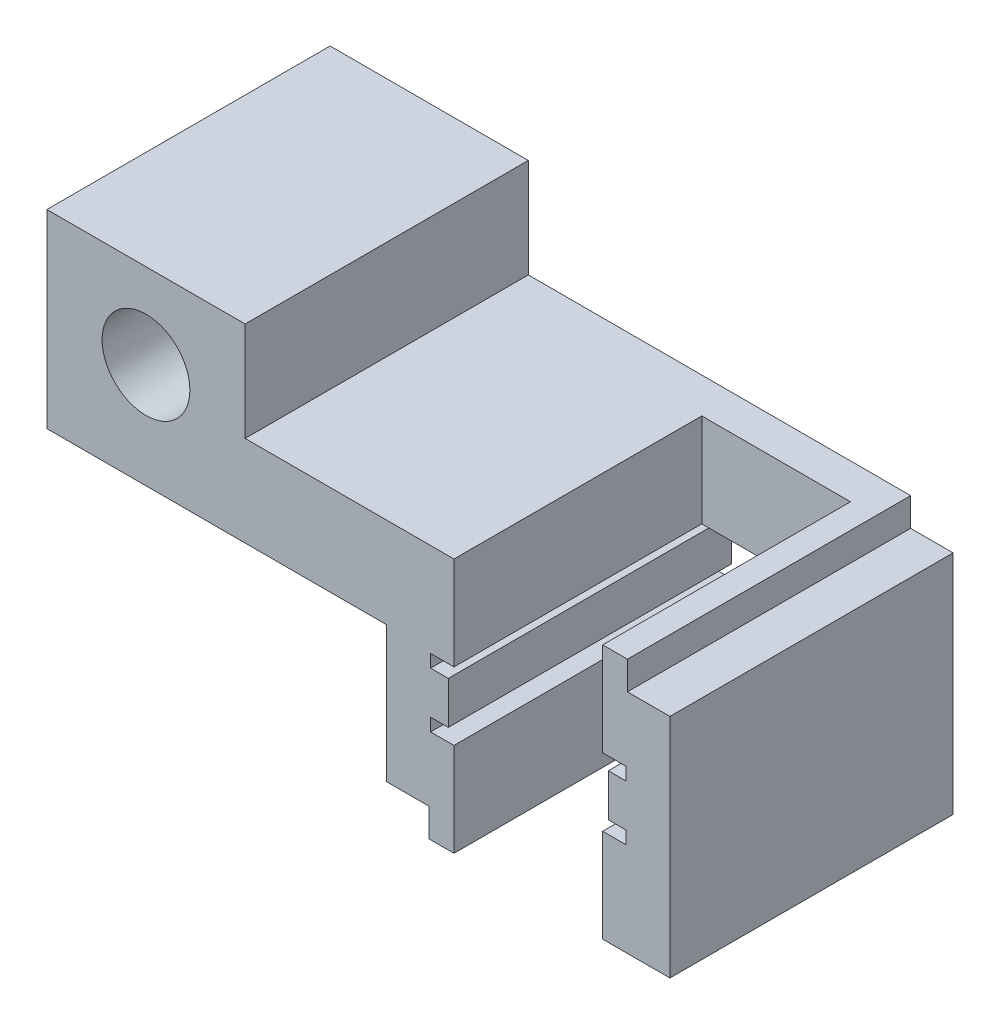
ISO-10303-21;
HEADER;
FILE_DESCRIPTION(('STEP AP214'),'2;1');
FILE_NAME('part.step','',(''),(''),'','','');
FILE_SCHEMA(('AUTOMOTIVE_DESIGN { 1 0 10303 214 1 1 1 1 }'));
ENDSEC;
DATA;
#1=APPLICATION_CONTEXT('core data for automotive mechanical design processes');
#2=APPLICATION_PROTOCOL_DEFINITION('international standard','automotive_design',2000,#1);
#3=PRODUCT_CONTEXT('',#1,'mechanical');
#4=PRODUCT('Part','Part','',(#3));
#5=PRODUCT_RELATED_PRODUCT_CATEGORY('part','',(#4));
#6=PRODUCT_DEFINITION_FORMATION('','',#4);
#7=PRODUCT_DEFINITION_CONTEXT('part definition',#1,'design');
#8=PRODUCT_DEFINITION('design','',#6,#7);
#9=PRODUCT_DEFINITION_SHAPE('','',#8);
#10=(LENGTH_UNIT() NAMED_UNIT(*) SI_UNIT(.MILLI.,.METRE.));
#11=(NAMED_UNIT(*) PLANE_ANGLE_UNIT() SI_UNIT($,.RADIAN.));
#12=(NAMED_UNIT(*) SI_UNIT($,.STERADIAN.) SOLID_ANGLE_UNIT());
#13=UNCERTAINTY_MEASURE_WITH_UNIT(LENGTH_MEASURE(1.E-05),#10,'distance_accuracy_value','');
#14=(GEOMETRIC_REPRESENTATION_CONTEXT(3) GLOBAL_UNCERTAINTY_ASSIGNED_CONTEXT((#13)) GLOBAL_UNIT_ASSIGNED_CONTEXT((#10,
#11,#12)) REPRESENTATION_CONTEXT('',''));
#15=CARTESIAN_POINT('',(0.,0.,0.));
#16=DIRECTION('',(0.,0.,1.));
#17=DIRECTION('',(1.,0.,0.));
#18=AXIS2_PLACEMENT_3D('',#15,#16,#17);
#19=CARTESIAN_POINT('',(0.,0.,0.));
#20=DIRECTION('',(0.,0.,1.));
#21=DIRECTION('',(1.,0.,0.));
#22=AXIS2_PLACEMENT_3D('',#19,#20,#21);
#23=PLANE('',#22);
#24=DIRECTION('',(-1.,0.,0.));
#25=VECTOR('',#24,1.);
#26=CARTESIAN_POINT('',(-9.54356846473029,10.3630705394191,0.));
#27=LINE('',#26,#25);
#28=CARTESIAN_POINT('',(-4.79356846473029,10.3630705394191,0.));
#29=VERTEX_POINT('',#28);
#30=CARTESIAN_POINT('',(-19.5435684647303,10.3630705394191,0.));
#31=VERTEX_POINT('',#30);
#32=EDGE_CURVE('E472',#29,#31,#27,.T.);
#33=ORIENTED_EDGE('',*,*,#32,.T.);
#34=DIRECTION('',(0.,-1.,0.));
#35=VECTOR('',#34,1.);
#36=CARTESIAN_POINT('',(-19.5435684647303,17.3630705394191,0.));
#37=LINE('',#36,#35);
#38=CARTESIAN_POINT('',(-19.5435684647303,17.3630705394191,0.));
#39=VERTEX_POINT('',#38);
#40=EDGE_CURVE('E257',#39,#31,#37,.T.);
#41=ORIENTED_EDGE('',*,*,#40,.F.);
#42=DIRECTION('',(1.,0.,0.));
#43=VECTOR('',#42,1.);
#44=CARTESIAN_POINT('',(-33.5435684647303,17.3630705394191,0.));
#45=LINE('',#44,#43);
#46=CARTESIAN_POINT('',(-33.5435684647303,17.3630705394191,0.));
#47=VERTEX_POINT('',#46);
#48=EDGE_CURVE('E267',#47,#39,#45,.T.);
#49=ORIENTED_EDGE('',*,*,#48,.F.);
#50=DIRECTION('',(0.,1.,0.));
#51=VECTOR('',#50,1.);
#52=CARTESIAN_POINT('',(-33.5435684647303,17.3630705394191,0.));
#53=LINE('',#52,#51);
#54=CARTESIAN_POINT('',(-33.5435684647303,3.96307053941909,0.));
#55=VERTEX_POINT('',#54);
#56=EDGE_CURVE('E277',#55,#47,#53,.T.);
#57=ORIENTED_EDGE('',*,*,#56,.F.);
#58=DIRECTION('',(1.,0.,0.));
#59=VECTOR('',#58,1.);
#60=CARTESIAN_POINT('',(-33.5435684647303,3.96307053941909,0.));
#61=LINE('',#60,#59);
#62=CARTESIAN_POINT('',(-9.54356846473029,3.96307053941909,0.));
#63=VERTEX_POINT('',#62);
#64=EDGE_CURVE('E275',#55,#63,#61,.T.);
#65=ORIENTED_EDGE('',*,*,#64,.T.);
#66=DIRECTION('',(0.,-1.,0.));
#67=VECTOR('',#66,1.);
#68=CARTESIAN_POINT('',(-9.54356846473029,2.86307053941909,0.));
#69=LINE('',#68,#67);
#70=CARTESIAN_POINT('',(-9.54356846473028,-5.63692946058091,0.));
#71=VERTEX_POINT('',#70);
#72=EDGE_CURVE('E482',#63,#71,#69,.T.);
#73=ORIENTED_EDGE('',*,*,#72,.T.);
#74=DIRECTION('',(-1.,0.,0.));
#75=VECTOR('',#74,1.);
#76=CARTESIAN_POINT('',(-9.54356846473028,-5.63692946058091,0.));
#77=LINE('',#76,#75);
#78=CARTESIAN_POINT('',(-6.54356846473028,-5.63692946058091,0.));
#79=VERTEX_POINT('',#78);
#80=EDGE_CURVE('E284',#79,#71,#77,.T.);
#81=ORIENTED_EDGE('',*,*,#80,.F.);
#82=DIRECTION('',(0.,1.,0.));
#83=VECTOR('',#82,1.);
#84=CARTESIAN_POINT('',(-6.54356846473028,-7.63692946058091,0.));
#85=LINE('',#84,#83);
#86=CARTESIAN_POINT('',(-6.54356846473028,-7.63692946058091,0.));
#87=VERTEX_POINT('',#86);
#88=EDGE_CURVE('E288',#87,#79,#85,.T.);
#89=ORIENTED_EDGE('',*,*,#88,.F.);
#90=DIRECTION('',(1.,0.,0.));
#91=VECTOR('',#90,1.);
#92=CARTESIAN_POINT('',(-9.54356846473028,-7.63692946058091,0.));
#93=LINE('',#92,#91);
#94=CARTESIAN_POINT('',(-4.79356846473028,-7.63692946058091,0.));
#95=VERTEX_POINT('',#94);
#96=EDGE_CURVE('E468',#87,#95,#93,.T.);
#97=ORIENTED_EDGE('',*,*,#96,.T.);
#98=DIRECTION('',(0.,-1.,0.));
#99=VECTOR('',#98,1.);
#100=CARTESIAN_POINT('',(-4.79356846473028,-1.03692946058091,0.));
#101=LINE('',#100,#99);
#102=CARTESIAN_POINT('',(-4.79356846473028,-1.03692946058091,0.));
#103=VERTEX_POINT('',#102);
#104=EDGE_CURVE('E315',#103,#95,#101,.T.);
#105=ORIENTED_EDGE('',*,*,#104,.F.);
#106=DIRECTION('',(1.,0.,0.));
#107=VECTOR('',#106,1.);
#108=CARTESIAN_POINT('',(-6.44356846473029,-1.03692946058091,0.));
#109=LINE('',#108,#107);
#110=CARTESIAN_POINT('',(-6.44356846473029,-1.03692946058091,0.));
#111=VERTEX_POINT('',#110);
#112=EDGE_CURVE('E425',#111,#103,#109,.T.);
#113=ORIENTED_EDGE('',*,*,#112,.F.);
#114=DIRECTION('',(0.,-1.,0.));
#115=VECTOR('',#114,1.);
#116=CARTESIAN_POINT('',(-6.44356846473029,-0.136929460580913,0.));
#117=LINE('',#116,#115);
#118=CARTESIAN_POINT('',(-6.44356846473029,-0.136929460580913,0.));
#119=VERTEX_POINT('',#118);
#120=EDGE_CURVE('E400',#119,#111,#117,.T.);
#121=ORIENTED_EDGE('',*,*,#120,.F.);
#122=DIRECTION('',(-1.,0.,0.));
#123=VECTOR('',#122,1.);
#124=CARTESIAN_POINT('',(-6.44356846473029,-0.136929460580913,0.));
#125=LINE('',#124,#123);
#126=CARTESIAN_POINT('',(-5.19356846473029,-0.136929460580913,0.));
#127=VERTEX_POINT('',#126);
#128=EDGE_CURVE('E431',#127,#119,#125,.T.);
#129=ORIENTED_EDGE('',*,*,#128,.F.);
#130=DIRECTION('',(0.,-1.,0.));
#131=VECTOR('',#130,1.);
#132=CARTESIAN_POINT('',(-5.19356846473029,2.86307053941909,0.));
#133=LINE('',#132,#131);
#134=CARTESIAN_POINT('',(-5.19356846473029,2.86307053941909,0.));
#135=VERTEX_POINT('',#134);
#136=EDGE_CURVE('E436',#135,#127,#133,.T.);
#137=ORIENTED_EDGE('',*,*,#136,.F.);
#138=DIRECTION('',(1.,0.,0.));
#139=VECTOR('',#138,1.);
#140=CARTESIAN_POINT('',(-6.44356846473029,2.86307053941909,0.));
#141=LINE('',#140,#139);
#142=CARTESIAN_POINT('',(-6.44356846473029,2.86307053941909,0.));
#143=VERTEX_POINT('',#142);
#144=EDGE_CURVE('E389',#143,#135,#141,.T.);
#145=ORIENTED_EDGE('',*,*,#144,.F.);
#146=DIRECTION('',(0.,-1.,0.));
#147=VECTOR('',#146,1.);
#148=CARTESIAN_POINT('',(-6.44356846473029,3.76307053941909,0.));
#149=LINE('',#148,#147);
#150=CARTESIAN_POINT('',(-6.44356846473029,3.76307053941909,0.));
#151=VERTEX_POINT('',#150);
#152=EDGE_CURVE('E363',#151,#143,#149,.T.);
#153=ORIENTED_EDGE('',*,*,#152,.F.);
#154=DIRECTION('',(-1.,0.,0.));
#155=VECTOR('',#154,1.);
#156=CARTESIAN_POINT('',(-6.44356846473029,3.76307053941909,0.));
#157=LINE('',#156,#155);
#158=CARTESIAN_POINT('',(-4.79356846473029,3.76307053941909,0.));
#159=VERTEX_POINT('',#158);
#160=EDGE_CURVE('E394',#159,#151,#157,.T.);
#161=ORIENTED_EDGE('',*,*,#160,.F.);
#162=DIRECTION('',(0.,-1.,0.));
#163=VECTOR('',#162,1.);
#164=CARTESIAN_POINT('',(-4.79356846473029,10.3630705394191,0.));
#165=LINE('',#164,#163);
#166=EDGE_CURVE('E337',#29,#159,#165,.T.);
#167=ORIENTED_EDGE('',*,*,#166,.F.);
#168=EDGE_LOOP('',(#33,#41,#49,#57,#65,#73,#81,#89,#97,#105,#113,#121,#129,#137,#145,#153,#161,#167));
#169=FACE_BOUND('',#168,.T.);
#170=CARTESIAN_POINT('',(-26.5435684647303,11.3630705394191,0.));
#171=DIRECTION('',(0.,0.,1.));
#172=DIRECTION('',(1.,0.,0.));
#173=AXIS2_PLACEMENT_3D('',#170,#171,#172);
#174=CIRCLE('',#173,3.1);
#175=CARTESIAN_POINT('',(-23.4435684647303,11.3630705394191,0.));
#176=VERTEX_POINT('',#175);
#177=EDGE_CURVE('E613',#176,#176,#174,.T.);
#178=ORIENTED_EDGE('',*,*,#177,.F.);
#179=EDGE_LOOP('',(#178));
#180=FACE_BOUND('',#179,.T.);
#181=ADVANCED_FACE('F35',(#169,#180),#23,.T.);
#182=CARTESIAN_POINT('',(-9.54356846473029,2.86307053941909,-20.));
#183=DIRECTION('',(-1.,0.,0.));
#184=DIRECTION('',(0.,0.,1.));
#185=AXIS2_PLACEMENT_3D('',#182,#183,#184);
#186=PLANE('',#185);
#187=DIRECTION('',(0.,0.,1.));
#188=VECTOR('',#187,1.);
#189=CARTESIAN_POINT('',(-9.54356846473029,3.96307053941909,-20.));
#190=LINE('',#189,#188);
#191=CARTESIAN_POINT('',(-9.54356846473029,3.96307053941909,-20.));
#192=VERTEX_POINT('',#191);
#193=EDGE_CURVE('E52',#192,#63,#190,.T.);
#194=ORIENTED_EDGE('',*,*,#193,.F.);
#195=DIRECTION('',(0.,-1.,0.));
#196=VECTOR('',#195,1.);
#197=CARTESIAN_POINT('',(-9.54356846473029,2.86307053941909,-20.));
#198=LINE('',#197,#196);
#199=CARTESIAN_POINT('',(-9.54356846473028,-5.63692946058091,-20.));
#200=VERTEX_POINT('',#199);
#201=EDGE_CURVE('E44',#192,#200,#198,.T.);
#202=ORIENTED_EDGE('',*,*,#201,.T.);
#203=DIRECTION('',(0.,0.,1.));
#204=VECTOR('',#203,1.);
#205=CARTESIAN_POINT('',(-9.54356846473028,-5.63692946058091,-20.));
#206=LINE('',#205,#204);
#207=EDGE_CURVE('E294',#200,#71,#206,.T.);
#208=ORIENTED_EDGE('',*,*,#207,.T.);
#209=ORIENTED_EDGE('',*,*,#72,.F.);
#210=EDGE_LOOP('',(#194,#202,#208,#209));
#211=FACE_BOUND('',#210,.T.);
#212=ADVANCED_FACE('F37',(#211),#186,.T.);
#213=CARTESIAN_POINT('',(10.4564315352697,2.86307053941909,-20.));
#214=DIRECTION('',(1.,0.,0.));
#215=DIRECTION('',(0.,0.,-1.));
#216=AXIS2_PLACEMENT_3D('',#213,#214,#215);
#217=PLANE('',#216);
#218=DIRECTION('',(0.,0.,1.));
#219=VECTOR('',#218,1.);
#220=CARTESIAN_POINT('',(10.4564315352697,8.36307053941909,-20.));
#221=LINE('',#220,#219);
#222=CARTESIAN_POINT('',(10.4564315352697,8.36307053941909,-20.));
#223=VERTEX_POINT('',#222);
#224=CARTESIAN_POINT('',(10.4564315352697,8.36307053941909,0.));
#225=VERTEX_POINT('',#224);
#226=EDGE_CURVE('E312',#223,#225,#221,.T.);
#227=ORIENTED_EDGE('',*,*,#226,.T.);
#228=DIRECTION('',(0.,1.,0.));
#229=VECTOR('',#228,1.);
#230=CARTESIAN_POINT('',(10.4564315352697,2.86307053941909,0.));
#231=LINE('',#230,#229);
#232=CARTESIAN_POINT('',(10.4564315352697,-7.63692946058091,0.));
#233=VERTEX_POINT('',#232);
#234=EDGE_CURVE('E494',#233,#225,#231,.T.);
#235=ORIENTED_EDGE('',*,*,#234,.F.);
#236=DIRECTION('',(0.,0.,1.));
#237=VECTOR('',#236,1.);
#238=CARTESIAN_POINT('',(10.4564315352697,-7.63692946058091,-20.));
#239=LINE('',#238,#237);
#240=CARTESIAN_POINT('',(10.4564315352697,-7.63692946058091,-20.));
#241=VERTEX_POINT('',#240);
#242=EDGE_CURVE('E467',#241,#233,#239,.T.);
#243=ORIENTED_EDGE('',*,*,#242,.F.);
#244=DIRECTION('',(0.,1.,0.));
#245=VECTOR('',#244,1.);
#246=CARTESIAN_POINT('',(10.4564315352697,2.86307053941909,-20.));
#247=LINE('',#246,#245);
#248=EDGE_CURVE('E11',#241,#223,#247,.T.);
#249=ORIENTED_EDGE('',*,*,#248,.T.);
#250=EDGE_LOOP('',(#227,#235,#243,#249));
#251=FACE_BOUND('',#250,.T.);
#252=ADVANCED_FACE('F508',(#251),#217,.T.);
#253=CARTESIAN_POINT('',(0.,0.,-20.));
#254=DIRECTION('',(0.,0.,1.));
#255=DIRECTION('',(1.,0.,0.));
#256=AXIS2_PLACEMENT_3D('',#253,#254,#255);
#257=PLANE('',#256);
#258=CARTESIAN_POINT('',(-26.5435684647303,11.3630705394191,-20.));
#259=DIRECTION('',(0.,0.,1.));
#260=DIRECTION('',(1.,0.,0.));
#261=AXIS2_PLACEMENT_3D('',#258,#259,#260);
#262=CIRCLE('',#261,1.45);
#263=CARTESIAN_POINT('',(-25.0935684647303,11.3630705394191,-20.));
#264=VERTEX_POINT('',#263);
#265=EDGE_CURVE('E607',#264,#264,#262,.T.);
#266=ORIENTED_EDGE('',*,*,#265,.T.);
#267=EDGE_LOOP('',(#266));
#268=FACE_BOUND('',#267,.T.);
#269=DIRECTION('',(0.,-1.,0.));
#270=VECTOR('',#269,1.);
#271=CARTESIAN_POINT('',(-6.44356846473029,3.76307053941909,-20.));
#272=LINE('',#271,#270);
#273=CARTESIAN_POINT('',(-6.44356846473029,3.76307053941909,-20.));
#274=VERTEX_POINT('',#273);
#275=CARTESIAN_POINT('',(-6.44356846473029,2.86307053941909,-20.));
#276=VERTEX_POINT('',#275);
#277=EDGE_CURVE('E371',#274,#276,#272,.T.);
#278=ORIENTED_EDGE('',*,*,#277,.T.);
#279=DIRECTION('',(1.,0.,0.));
#280=VECTOR('',#279,1.);
#281=CARTESIAN_POINT('',(-6.44356846473029,2.86307053941909,-20.));
#282=LINE('',#281,#280);
#283=CARTESIAN_POINT('',(-5.19356846473029,2.86307053941909,-20.));
#284=VERTEX_POINT('',#283);
#285=EDGE_CURVE('E376',#276,#284,#282,.T.);
#286=ORIENTED_EDGE('',*,*,#285,.T.);
#287=DIRECTION('',(0.,-1.,0.));
#288=VECTOR('',#287,1.);
#289=CARTESIAN_POINT('',(-5.19356846473029,2.86307053941909,-20.));
#290=LINE('',#289,#288);
#291=CARTESIAN_POINT('',(-5.19356846473029,-0.136929460580913,-20.));
#292=VERTEX_POINT('',#291);
#293=EDGE_CURVE('E443',#284,#292,#290,.T.);
#294=ORIENTED_EDGE('',*,*,#293,.T.);
#295=DIRECTION('',(-1.,0.,0.));
#296=VECTOR('',#295,1.);
#297=CARTESIAN_POINT('',(-6.44356846473029,-0.136929460580913,-20.));
#298=LINE('',#297,#296);
#299=CARTESIAN_POINT('',(-6.44356846473029,-0.136929460580913,-20.));
#300=VERTEX_POINT('',#299);
#301=EDGE_CURVE('E417',#292,#300,#298,.T.);
#302=ORIENTED_EDGE('',*,*,#301,.T.);
#303=DIRECTION('',(0.,-1.,0.));
#304=VECTOR('',#303,1.);
#305=CARTESIAN_POINT('',(-6.44356846473029,-0.136929460580913,-20.));
#306=LINE('',#305,#304);
#307=CARTESIAN_POINT('',(-6.44356846473029,-1.03692946058091,-20.));
#308=VERTEX_POINT('',#307);
#309=EDGE_CURVE('E407',#300,#308,#306,.T.);
#310=ORIENTED_EDGE('',*,*,#309,.T.);
#311=DIRECTION('',(1.,0.,0.));
#312=VECTOR('',#311,1.);
#313=CARTESIAN_POINT('',(-6.44356846473029,-1.03692946058091,-20.));
#314=LINE('',#313,#312);
#315=CARTESIAN_POINT('',(7.35643153526971,-1.03692946058091,-20.));
#316=VERTEX_POINT('',#315);
#317=EDGE_CURVE('E410',#308,#316,#314,.T.);
#318=ORIENTED_EDGE('',*,*,#317,.T.);
#319=DIRECTION('',(0.,1.,0.));
#320=VECTOR('',#319,1.);
#321=CARTESIAN_POINT('',(7.35643153526971,-0.136929460580912,-20.));
#322=LINE('',#321,#320);
#323=CARTESIAN_POINT('',(7.35643153526971,-0.136929460580912,-20.));
#324=VERTEX_POINT('',#323);
#325=EDGE_CURVE('E414',#316,#324,#322,.T.);
#326=ORIENTED_EDGE('',*,*,#325,.T.);
#327=CARTESIAN_POINT('',(6.10643153526971,-0.136929460580912,-20.));
#328=VERTEX_POINT('',#327);
#329=EDGE_CURVE('E418',#324,#328,#298,.T.);
#330=ORIENTED_EDGE('',*,*,#329,.T.);
#331=DIRECTION('',(0.,1.,0.));
#332=VECTOR('',#331,1.);
#333=CARTESIAN_POINT('',(6.10643153526971,2.86307053941909,-20.));
#334=LINE('',#333,#332);
#335=CARTESIAN_POINT('',(6.10643153526971,2.86307053941909,-20.));
#336=VERTEX_POINT('',#335);
#337=EDGE_CURVE('E446',#328,#336,#334,.T.);
#338=ORIENTED_EDGE('',*,*,#337,.T.);
#339=CARTESIAN_POINT('',(7.35643153526971,2.86307053941909,-20.));
#340=VERTEX_POINT('',#339);
#341=EDGE_CURVE('E374',#336,#340,#282,.T.);
#342=ORIENTED_EDGE('',*,*,#341,.T.);
#343=DIRECTION('',(0.,1.,0.));
#344=VECTOR('',#343,1.);
#345=CARTESIAN_POINT('',(7.35643153526971,3.76307053941909,-20.));
#346=LINE('',#345,#344);
#347=CARTESIAN_POINT('',(7.35643153526971,3.76307053941909,-20.));
#348=VERTEX_POINT('',#347);
#349=EDGE_CURVE('E379',#340,#348,#346,.T.);
#350=ORIENTED_EDGE('',*,*,#349,.T.);
#351=DIRECTION('',(-1.,0.,0.));
#352=VECTOR('',#351,1.);
#353=CARTESIAN_POINT('',(-6.44356846473029,3.76307053941909,-20.));
#354=LINE('',#353,#352);
#355=EDGE_CURVE('E382',#348,#274,#354,.T.);
#356=ORIENTED_EDGE('',*,*,#355,.T.);
#357=EDGE_LOOP('',(#278,#286,#294,#302,#310,#318,#326,#330,#338,#342,#350,#356));
#358=FACE_BOUND('',#357,.T.);
#359=DIRECTION('',(0.,-1.,0.));
#360=VECTOR('',#359,1.);
#361=CARTESIAN_POINT('',(-19.5435684647303,17.3630705394191,-20.));
#362=LINE('',#361,#360);
#363=CARTESIAN_POINT('',(-19.5435684647303,17.3630705394191,-20.));
#364=VERTEX_POINT('',#363);
#365=CARTESIAN_POINT('',(-19.5435684647303,10.3630705394191,-20.));
#366=VERTEX_POINT('',#365);
#367=EDGE_CURVE('E246',#364,#366,#362,.T.);
#368=ORIENTED_EDGE('',*,*,#367,.T.);
#369=DIRECTION('',(-1.,0.,0.));
#370=VECTOR('',#369,1.);
#371=CARTESIAN_POINT('',(-9.54356846473029,10.3630705394191,-20.));
#372=LINE('',#371,#370);
#373=CARTESIAN_POINT('',(7.45643153526972,10.3630705394191,-20.));
#374=VERTEX_POINT('',#373);
#375=EDGE_CURVE('E476',#374,#366,#372,.T.);
#376=ORIENTED_EDGE('',*,*,#375,.F.);
#377=DIRECTION('',(0.,-1.,0.));
#378=VECTOR('',#377,1.);
#379=CARTESIAN_POINT('',(7.45643153526971,10.3630705394191,-20.));
#380=LINE('',#379,#378);
#381=CARTESIAN_POINT('',(7.45643153526971,8.36307053941909,-20.));
#382=VERTEX_POINT('',#381);
#383=EDGE_CURVE('E301',#374,#382,#380,.T.);
#384=ORIENTED_EDGE('',*,*,#383,.T.);
#385=DIRECTION('',(1.,0.,0.));
#386=VECTOR('',#385,1.);
#387=CARTESIAN_POINT('',(10.4564315352697,8.36307053941909,-20.));
#388=LINE('',#387,#386);
#389=EDGE_CURVE('E304',#382,#223,#388,.T.);
#390=ORIENTED_EDGE('',*,*,#389,.T.);
#391=ORIENTED_EDGE('',*,*,#248,.F.);
#392=DIRECTION('',(1.,0.,0.));
#393=VECTOR('',#392,1.);
#394=CARTESIAN_POINT('',(-9.54356846473028,-7.63692946058091,-20.));
#395=LINE('',#394,#393);
#396=CARTESIAN_POINT('',(-6.54356846473028,-7.63692946058091,-20.));
#397=VERTEX_POINT('',#396);
#398=EDGE_CURVE('E465',#397,#241,#395,.T.);
#399=ORIENTED_EDGE('',*,*,#398,.F.);
#400=DIRECTION('',(0.,1.,0.));
#401=VECTOR('',#400,1.);
#402=CARTESIAN_POINT('',(-6.54356846473028,-7.63692946058091,-20.));
#403=LINE('',#402,#401);
#404=CARTESIAN_POINT('',(-6.54356846473028,-5.63692946058091,-20.));
#405=VERTEX_POINT('',#404);
#406=EDGE_CURVE('E60',#397,#405,#403,.T.);
#407=ORIENTED_EDGE('',*,*,#406,.T.);
#408=DIRECTION('',(-1.,0.,0.));
#409=VECTOR('',#408,1.);
#410=CARTESIAN_POINT('',(-9.54356846473028,-5.63692946058091,-20.));
#411=LINE('',#410,#409);
#412=EDGE_CURVE('E283',#405,#200,#411,.T.);
#413=ORIENTED_EDGE('',*,*,#412,.T.);
#414=ORIENTED_EDGE('',*,*,#201,.F.);
#415=DIRECTION('',(1.,0.,0.));
#416=VECTOR('',#415,1.);
#417=CARTESIAN_POINT('',(-33.5435684647303,3.96307053941909,-20.));
#418=LINE('',#417,#416);
#419=CARTESIAN_POINT('',(-33.5435684647303,3.96307053941909,-20.));
#420=VERTEX_POINT('',#419);
#421=EDGE_CURVE('E291',#420,#192,#418,.T.);
#422=ORIENTED_EDGE('',*,*,#421,.F.);
#423=DIRECTION('',(0.,-1.,0.));
#424=VECTOR('',#423,1.);
#425=CARTESIAN_POINT('',(-33.5435684647303,17.3630705394191,-20.));
#426=LINE('',#425,#424);
#427=CARTESIAN_POINT('',(-33.5435684647303,17.3630705394191,-20.));
#428=VERTEX_POINT('',#427);
#429=EDGE_CURVE('E272',#428,#420,#426,.T.);
#430=ORIENTED_EDGE('',*,*,#429,.F.);
#431=DIRECTION('',(1.,0.,0.));
#432=VECTOR('',#431,1.);
#433=CARTESIAN_POINT('',(-33.5435684647303,17.3630705394191,-20.));
#434=LINE('',#433,#432);
#435=EDGE_CURVE('E264',#428,#364,#434,.T.);
#436=ORIENTED_EDGE('',*,*,#435,.T.);
#437=EDGE_LOOP('',(#368,#376,#384,#390,#391,#399,#407,#413,#414,#422,#430,#436));
#438=FACE_BOUND('',#437,.T.);
#439=ADVANCED_FACE('F269',(#268,#358,#438),#257,.F.);
#440=DIRECTION('',(1.,0.,0.));
#441=VECTOR('',#440,1.);
#442=CARTESIAN_POINT('',(10.4564315352697,8.36307053941909,0.));
#443=LINE('',#442,#441);
#444=CARTESIAN_POINT('',(7.45643153526971,8.36307053941909,0.));
#445=VERTEX_POINT('',#444);
#446=EDGE_CURVE('E305',#445,#225,#443,.T.);
#447=ORIENTED_EDGE('',*,*,#446,.F.);
#448=DIRECTION('',(0.,-1.,0.));
#449=VECTOR('',#448,1.);
#450=CARTESIAN_POINT('',(7.45643153526971,10.3630705394191,0.));
#451=LINE('',#450,#449);
#452=CARTESIAN_POINT('',(7.45643153526971,10.3630705394191,0.));
#453=VERTEX_POINT('',#452);
#454=EDGE_CURVE('E297',#453,#445,#451,.T.);
#455=ORIENTED_EDGE('',*,*,#454,.F.);
#456=CARTESIAN_POINT('',(5.70643153526972,10.3630705394191,0.));
#457=VERTEX_POINT('',#456);
#458=EDGE_CURVE('E473',#453,#457,#27,.T.);
#459=ORIENTED_EDGE('',*,*,#458,.T.);
#460=DIRECTION('',(0.,1.,0.));
#461=VECTOR('',#460,1.);
#462=CARTESIAN_POINT('',(5.70643153526972,10.3630705394191,0.));
#463=LINE('',#462,#461);
#464=CARTESIAN_POINT('',(5.70643153526971,3.76307053941909,0.));
#465=VERTEX_POINT('',#464);
#466=EDGE_CURVE('E348',#465,#457,#463,.T.);
#467=ORIENTED_EDGE('',*,*,#466,.F.);
#468=CARTESIAN_POINT('',(7.35643153526971,3.76307053941909,0.));
#469=VERTEX_POINT('',#468);
#470=EDGE_CURVE('E375',#469,#465,#157,.T.);
#471=ORIENTED_EDGE('',*,*,#470,.F.);
#472=DIRECTION('',(0.,1.,0.));
#473=VECTOR('',#472,1.);
#474=CARTESIAN_POINT('',(7.35643153526971,3.76307053941909,0.));
#475=LINE('',#474,#473);
#476=CARTESIAN_POINT('',(7.35643153526971,2.86307053941909,0.));
#477=VERTEX_POINT('',#476);
#478=EDGE_CURVE('E391',#477,#469,#475,.T.);
#479=ORIENTED_EDGE('',*,*,#478,.F.);
#480=CARTESIAN_POINT('',(6.10643153526971,2.86307053941909,0.));
#481=VERTEX_POINT('',#480);
#482=EDGE_CURVE('E388',#481,#477,#141,.T.);
#483=ORIENTED_EDGE('',*,*,#482,.F.);
#484=DIRECTION('',(0.,1.,0.));
#485=VECTOR('',#484,1.);
#486=CARTESIAN_POINT('',(6.10643153526971,2.86307053941909,0.));
#487=LINE('',#486,#485);
#488=CARTESIAN_POINT('',(6.10643153526971,-0.136929460580912,0.));
#489=VERTEX_POINT('',#488);
#490=EDGE_CURVE('E447',#489,#481,#487,.T.);
#491=ORIENTED_EDGE('',*,*,#490,.F.);
#492=CARTESIAN_POINT('',(7.35643153526971,-0.136929460580912,0.));
#493=VERTEX_POINT('',#492);
#494=EDGE_CURVE('E411',#493,#489,#125,.T.);
#495=ORIENTED_EDGE('',*,*,#494,.F.);
#496=DIRECTION('',(0.,1.,0.));
#497=VECTOR('',#496,1.);
#498=CARTESIAN_POINT('',(7.35643153526971,-0.136929460580912,0.));
#499=LINE('',#498,#497);
#500=CARTESIAN_POINT('',(7.35643153526971,-1.03692946058091,0.));
#501=VERTEX_POINT('',#500);
#502=EDGE_CURVE('E428',#501,#493,#499,.T.);
#503=ORIENTED_EDGE('',*,*,#502,.F.);
#504=CARTESIAN_POINT('',(5.70643153526972,-1.03692946058091,0.));
#505=VERTEX_POINT('',#504);
#506=EDGE_CURVE('E424',#505,#501,#109,.T.);
#507=ORIENTED_EDGE('',*,*,#506,.F.);
#508=DIRECTION('',(0.,1.,0.));
#509=VECTOR('',#508,1.);
#510=CARTESIAN_POINT('',(5.70643153526972,-1.03692946058091,0.));
#511=LINE('',#510,#509);
#512=CARTESIAN_POINT('',(5.70643153526972,-7.63692946058091,0.));
#513=VERTEX_POINT('',#512);
#514=EDGE_CURVE('E323',#513,#505,#511,.T.);
#515=ORIENTED_EDGE('',*,*,#514,.F.);
#516=EDGE_CURVE('E458',#513,#233,#93,.T.);
#517=ORIENTED_EDGE('',*,*,#516,.T.);
#518=ORIENTED_EDGE('',*,*,#234,.T.);
#519=EDGE_LOOP('',(#447,#455,#459,#467,#471,#479,#483,#491,#495,#503,#507,#515,#517,#518));
#520=FACE_BOUND('',#519,.T.);
#521=ADVANCED_FACE('F502',(#520),#23,.T.);
#522=CARTESIAN_POINT('',(-9.54356846473029,10.3630705394191,-20.));
#523=DIRECTION('',(0.,1.,0.));
#524=DIRECTION('',(0.,0.,1.));
#525=AXIS2_PLACEMENT_3D('',#522,#523,#524);
#526=PLANE('',#525);
#527=DIRECTION('',(0.,0.,1.));
#528=VECTOR('',#527,1.);
#529=CARTESIAN_POINT('',(7.45643153526971,10.3630705394191,-20.));
#530=LINE('',#529,#528);
#531=EDGE_CURVE('E308',#374,#453,#530,.T.);
#532=ORIENTED_EDGE('',*,*,#531,.F.);
#533=ORIENTED_EDGE('',*,*,#375,.T.);
#534=DIRECTION('',(0.,0.,1.));
#535=VECTOR('',#534,1.);
#536=CARTESIAN_POINT('',(-19.5435684647303,10.3630705394191,-20.));
#537=LINE('',#536,#535);
#538=EDGE_CURVE('E253',#366,#31,#537,.T.);
#539=ORIENTED_EDGE('',*,*,#538,.T.);
#540=ORIENTED_EDGE('',*,*,#32,.F.);
#541=DIRECTION('',(0.,0.,1.));
#542=VECTOR('',#541,1.);
#543=CARTESIAN_POINT('',(-4.79356846473029,10.3630705394191,-17.5));
#544=LINE('',#543,#542);
#545=CARTESIAN_POINT('',(-4.79356846473029,10.3630705394191,-17.5));
#546=VERTEX_POINT('',#545);
#547=EDGE_CURVE('E361',#546,#29,#544,.T.);
#548=ORIENTED_EDGE('',*,*,#547,.F.);
#549=DIRECTION('',(-1.,0.,0.));
#550=VECTOR('',#549,1.);
#551=CARTESIAN_POINT('',(-4.79356846473029,10.3630705394191,-17.5));
#552=LINE('',#551,#550);
#553=CARTESIAN_POINT('',(5.70643153526972,10.3630705394191,-17.5));
#554=VERTEX_POINT('',#553);
#555=EDGE_CURVE('E354',#554,#546,#552,.T.);
#556=ORIENTED_EDGE('',*,*,#555,.F.);
#557=DIRECTION('',(0.,0.,1.));
#558=VECTOR('',#557,1.);
#559=CARTESIAN_POINT('',(5.70643153526972,10.3630705394191,-17.5));
#560=LINE('',#559,#558);
#561=EDGE_CURVE('E364',#554,#457,#560,.T.);
#562=ORIENTED_EDGE('',*,*,#561,.T.);
#563=ORIENTED_EDGE('',*,*,#458,.F.);
#564=EDGE_LOOP('',(#532,#533,#539,#540,#548,#556,#562,#563));
#565=FACE_BOUND('',#564,.T.);
#566=ADVANCED_FACE('F524',(#565),#526,.T.);
#567=CARTESIAN_POINT('',(-9.54356846473028,-7.63692946058091,-20.));
#568=DIRECTION('',(0.,-1.,0.));
#569=DIRECTION('',(0.,0.,-1.));
#570=AXIS2_PLACEMENT_3D('',#567,#568,#569);
#571=PLANE('',#570);
#572=DIRECTION('',(0.,0.,1.));
#573=VECTOR('',#572,1.);
#574=CARTESIAN_POINT('',(-6.54356846473028,-7.63692946058091,-20.));
#575=LINE('',#574,#573);
#576=EDGE_CURVE('E287',#397,#87,#575,.T.);
#577=ORIENTED_EDGE('',*,*,#576,.F.);
#578=ORIENTED_EDGE('',*,*,#398,.T.);
#579=ORIENTED_EDGE('',*,*,#242,.T.);
#580=ORIENTED_EDGE('',*,*,#516,.F.);
#581=DIRECTION('',(0.,0.,1.));
#582=VECTOR('',#581,1.);
#583=CARTESIAN_POINT('',(5.70643153526972,-7.63692946058091,-17.5));
#584=LINE('',#583,#582);
#585=CARTESIAN_POINT('',(5.70643153526972,-7.63692946058091,-17.5));
#586=VERTEX_POINT('',#585);
#587=EDGE_CURVE('E341',#586,#513,#584,.T.);
#588=ORIENTED_EDGE('',*,*,#587,.F.);
#589=DIRECTION('',(1.,0.,0.));
#590=VECTOR('',#589,1.);
#591=CARTESIAN_POINT('',(-4.79356846473028,-7.63692946058091,-17.5));
#592=LINE('',#591,#590);
#593=CARTESIAN_POINT('',(-4.79356846473028,-7.63692946058091,-17.5));
#594=VERTEX_POINT('',#593);
#595=EDGE_CURVE('E322',#594,#586,#592,.T.);
#596=ORIENTED_EDGE('',*,*,#595,.F.);
#597=DIRECTION('',(0.,0.,1.));
#598=VECTOR('',#597,1.);
#599=CARTESIAN_POINT('',(-4.79356846473028,-7.63692946058091,-17.5));
#600=LINE('',#599,#598);
#601=EDGE_CURVE('E331',#594,#95,#600,.T.);
#602=ORIENTED_EDGE('',*,*,#601,.T.);
#603=ORIENTED_EDGE('',*,*,#96,.F.);
#604=EDGE_LOOP('',(#577,#578,#579,#580,#588,#596,#602,#603));
#605=FACE_BOUND('',#604,.T.);
#606=ADVANCED_FACE('F510',(#605),#571,.T.);
#607=CARTESIAN_POINT('',(-5.19356846473029,2.86307053941909,-20.));
#608=DIRECTION('',(-1.,0.,0.));
#609=DIRECTION('',(0.,0.,1.));
#610=AXIS2_PLACEMENT_3D('',#607,#608,#609);
#611=PLANE('',#610);
#612=ORIENTED_EDGE('',*,*,#136,.T.);
#613=DIRECTION('',(0.,0.,1.));
#614=VECTOR('',#613,1.);
#615=CARTESIAN_POINT('',(-5.19356846473029,-0.136929460580913,-20.));
#616=LINE('',#615,#614);
#617=EDGE_CURVE('E450',#292,#127,#616,.T.);
#618=ORIENTED_EDGE('',*,*,#617,.F.);
#619=ORIENTED_EDGE('',*,*,#293,.F.);
#620=DIRECTION('',(0.,0.,1.));
#621=VECTOR('',#620,1.);
#622=CARTESIAN_POINT('',(-5.19356846473029,2.86307053941909,-20.));
#623=LINE('',#622,#621);
#624=EDGE_CURVE('E455',#284,#135,#623,.T.);
#625=ORIENTED_EDGE('',*,*,#624,.T.);
#626=EDGE_LOOP('',(#612,#618,#619,#625));
#627=FACE_BOUND('',#626,.T.);
#628=ADVANCED_FACE('F589',(#627),#611,.F.);
#629=CARTESIAN_POINT('',(6.10643153526971,2.86307053941909,-20.));
#630=DIRECTION('',(1.,0.,0.));
#631=DIRECTION('',(0.,0.,-1.));
#632=AXIS2_PLACEMENT_3D('',#629,#630,#631);
#633=PLANE('',#632);
#634=ORIENTED_EDGE('',*,*,#490,.T.);
#635=DIRECTION('',(0.,0.,1.));
#636=VECTOR('',#635,1.);
#637=CARTESIAN_POINT('',(6.10643153526971,2.86307053941909,-20.));
#638=LINE('',#637,#636);
#639=EDGE_CURVE('E459',#336,#481,#638,.T.);
#640=ORIENTED_EDGE('',*,*,#639,.F.);
#641=ORIENTED_EDGE('',*,*,#337,.F.);
#642=DIRECTION('',(0.,0.,1.));
#643=VECTOR('',#642,1.);
#644=CARTESIAN_POINT('',(6.10643153526971,-0.136929460580912,-20.));
#645=LINE('',#644,#643);
#646=EDGE_CURVE('E461',#328,#489,#645,.T.);
#647=ORIENTED_EDGE('',*,*,#646,.T.);
#648=EDGE_LOOP('',(#634,#640,#641,#647));
#649=FACE_BOUND('',#648,.T.);
#650=ADVANCED_FACE('F550',(#649),#633,.F.);
#651=CARTESIAN_POINT('',(-6.44356846473029,-0.136929460580913,-20.));
#652=DIRECTION('',(0.,1.,0.));
#653=DIRECTION('',(-1.,0.,0.));
#654=AXIS2_PLACEMENT_3D('',#651,#652,#653);
#655=PLANE('',#654);
#656=ORIENTED_EDGE('',*,*,#128,.T.);
#657=DIRECTION('',(0.,0.,1.));
#658=VECTOR('',#657,1.);
#659=CARTESIAN_POINT('',(-6.44356846473029,-0.136929460580913,-20.));
#660=LINE('',#659,#658);
#661=EDGE_CURVE('E433',#300,#119,#660,.T.);
#662=ORIENTED_EDGE('',*,*,#661,.F.);
#663=ORIENTED_EDGE('',*,*,#301,.F.);
#664=ORIENTED_EDGE('',*,*,#617,.T.);
#665=EDGE_LOOP('',(#656,#662,#663,#664));
#666=FACE_BOUND('',#665,.T.);
#667=ADVANCED_FACE('F662',(#666),#655,.F.);
#668=ORIENTED_EDGE('',*,*,#329,.F.);
#669=DIRECTION('',(0.,0.,1.));
#670=VECTOR('',#669,1.);
#671=CARTESIAN_POINT('',(7.35643153526971,-0.136929460580912,-20.));
#672=LINE('',#671,#670);
#673=EDGE_CURVE('E437',#324,#493,#672,.T.);
#674=ORIENTED_EDGE('',*,*,#673,.T.);
#675=ORIENTED_EDGE('',*,*,#494,.T.);
#676=ORIENTED_EDGE('',*,*,#646,.F.);
#677=EDGE_LOOP('',(#668,#674,#675,#676));
#678=FACE_BOUND('',#677,.T.);
#679=ADVANCED_FACE('F555',(#678),#655,.F.);
#680=CARTESIAN_POINT('',(-6.44356846473029,-0.136929460580913,-20.));
#681=DIRECTION('',(-1.,0.,0.));
#682=DIRECTION('',(0.,0.,1.));
#683=AXIS2_PLACEMENT_3D('',#680,#681,#682);
#684=PLANE('',#683);
#685=ORIENTED_EDGE('',*,*,#120,.T.);
#686=DIRECTION('',(0.,0.,1.));
#687=VECTOR('',#686,1.);
#688=CARTESIAN_POINT('',(-6.44356846473029,-1.03692946058091,-20.));
#689=LINE('',#688,#687);
#690=EDGE_CURVE('E421',#308,#111,#689,.T.);
#691=ORIENTED_EDGE('',*,*,#690,.F.);
#692=ORIENTED_EDGE('',*,*,#309,.F.);
#693=ORIENTED_EDGE('',*,*,#661,.T.);
#694=EDGE_LOOP('',(#685,#691,#692,#693));
#695=FACE_BOUND('',#694,.T.);
#696=ADVANCED_FACE('F582',(#695),#684,.F.);
#697=CARTESIAN_POINT('',(7.35643153526971,-0.136929460580912,-20.));
#698=DIRECTION('',(1.,0.,0.));
#699=DIRECTION('',(0.,0.,-1.));
#700=AXIS2_PLACEMENT_3D('',#697,#698,#699);
#701=PLANE('',#700);
#702=ORIENTED_EDGE('',*,*,#502,.T.);
#703=ORIENTED_EDGE('',*,*,#673,.F.);
#704=ORIENTED_EDGE('',*,*,#325,.F.);
#705=DIRECTION('',(0.,0.,1.));
#706=VECTOR('',#705,1.);
#707=CARTESIAN_POINT('',(7.35643153526971,-1.03692946058091,-20.));
#708=LINE('',#707,#706);
#709=EDGE_CURVE('E439',#316,#501,#708,.T.);
#710=ORIENTED_EDGE('',*,*,#709,.T.);
#711=EDGE_LOOP('',(#702,#703,#704,#710));
#712=FACE_BOUND('',#711,.T.);
#713=ADVANCED_FACE('F560',(#712),#701,.F.);
#714=CARTESIAN_POINT('',(-6.44356846473029,-1.03692946058091,-20.));
#715=DIRECTION('',(0.,-1.,0.));
#716=DIRECTION('',(1.,0.,0.));
#717=AXIS2_PLACEMENT_3D('',#714,#715,#716);
#718=PLANE('',#717);
#719=ORIENTED_EDGE('',*,*,#112,.T.);
#720=DIRECTION('',(0.,0.,1.));
#721=VECTOR('',#720,1.);
#722=CARTESIAN_POINT('',(-4.79356846473028,-1.03692946058091,-17.5));
#723=LINE('',#722,#721);
#724=CARTESIAN_POINT('',(-4.79356846473028,-1.03692946058091,-17.5));
#725=VERTEX_POINT('',#724);
#726=EDGE_CURVE('E335',#725,#103,#723,.T.);
#727=ORIENTED_EDGE('',*,*,#726,.F.);
#728=DIRECTION('',(-1.,0.,0.));
#729=VECTOR('',#728,1.);
#730=CARTESIAN_POINT('',(-4.79356846473028,-1.03692946058091,-17.5));
#731=LINE('',#730,#729);
#732=CARTESIAN_POINT('',(5.70643153526972,-1.03692946058091,-17.5));
#733=VERTEX_POINT('',#732);
#734=EDGE_CURVE('E328',#733,#725,#731,.T.);
#735=ORIENTED_EDGE('',*,*,#734,.F.);
#736=DIRECTION('',(0.,0.,1.));
#737=VECTOR('',#736,1.);
#738=CARTESIAN_POINT('',(5.70643153526972,-1.03692946058091,-17.5));
#739=LINE('',#738,#737);
#740=EDGE_CURVE('E338',#733,#505,#739,.T.);
#741=ORIENTED_EDGE('',*,*,#740,.T.);
#742=ORIENTED_EDGE('',*,*,#506,.T.);
#743=ORIENTED_EDGE('',*,*,#709,.F.);
#744=ORIENTED_EDGE('',*,*,#317,.F.);
#745=ORIENTED_EDGE('',*,*,#690,.T.);
#746=EDGE_LOOP('',(#719,#727,#735,#741,#742,#743,#744,#745));
#747=FACE_BOUND('',#746,.T.);
#748=ADVANCED_FACE('F563',(#747),#718,.F.);
#749=CARTESIAN_POINT('',(-6.44356846473029,2.86307053941909,-20.));
#750=DIRECTION('',(0.,-1.,0.));
#751=DIRECTION('',(0.,0.,-1.));
#752=AXIS2_PLACEMENT_3D('',#749,#750,#751);
#753=PLANE('',#752);
#754=ORIENTED_EDGE('',*,*,#285,.F.);
#755=DIRECTION('',(0.,0.,1.));
#756=VECTOR('',#755,1.);
#757=CARTESIAN_POINT('',(-6.44356846473029,2.86307053941909,-20.));
#758=LINE('',#757,#756);
#759=EDGE_CURVE('E385',#276,#143,#758,.T.);
#760=ORIENTED_EDGE('',*,*,#759,.T.);
#761=ORIENTED_EDGE('',*,*,#144,.T.);
#762=ORIENTED_EDGE('',*,*,#624,.F.);
#763=EDGE_LOOP('',(#754,#760,#761,#762));
#764=FACE_BOUND('',#763,.T.);
#765=ADVANCED_FACE('F593',(#764),#753,.F.);
#766=ORIENTED_EDGE('',*,*,#482,.T.);
#767=DIRECTION('',(0.,0.,1.));
#768=VECTOR('',#767,1.);
#769=CARTESIAN_POINT('',(7.35643153526971,2.86307053941909,-20.));
#770=LINE('',#769,#768);
#771=EDGE_CURVE('E403',#340,#477,#770,.T.);
#772=ORIENTED_EDGE('',*,*,#771,.F.);
#773=ORIENTED_EDGE('',*,*,#341,.F.);
#774=ORIENTED_EDGE('',*,*,#639,.T.);
#775=EDGE_LOOP('',(#766,#772,#773,#774));
#776=FACE_BOUND('',#775,.T.);
#777=ADVANCED_FACE('F546',(#776),#753,.F.);
#778=CARTESIAN_POINT('',(-6.44356846473029,3.76307053941909,-20.));
#779=DIRECTION('',(-1.,0.,0.));
#780=DIRECTION('',(0.,0.,1.));
#781=AXIS2_PLACEMENT_3D('',#778,#779,#780);
#782=PLANE('',#781);
#783=ORIENTED_EDGE('',*,*,#152,.T.);
#784=ORIENTED_EDGE('',*,*,#759,.F.);
#785=ORIENTED_EDGE('',*,*,#277,.F.);
#786=DIRECTION('',(0.,0.,1.));
#787=VECTOR('',#786,1.);
#788=CARTESIAN_POINT('',(-6.44356846473029,3.76307053941909,-20.));
#789=LINE('',#788,#787);
#790=EDGE_CURVE('E397',#274,#151,#789,.T.);
#791=ORIENTED_EDGE('',*,*,#790,.T.);
#792=EDGE_LOOP('',(#783,#784,#785,#791));
#793=FACE_BOUND('',#792,.T.);
#794=ADVANCED_FACE('F597',(#793),#782,.F.);
#795=CARTESIAN_POINT('',(-6.44356846473029,3.76307053941909,-20.));
#796=DIRECTION('',(0.,1.,0.));
#797=DIRECTION('',(-1.,0.,0.));
#798=AXIS2_PLACEMENT_3D('',#795,#796,#797);
#799=PLANE('',#798);
#800=DIRECTION('',(1.,0.,0.));
#801=VECTOR('',#800,1.);
#802=CARTESIAN_POINT('',(-4.79356846473029,3.76307053941909,-17.5));
#803=LINE('',#802,#801);
#804=CARTESIAN_POINT('',(-4.79356846473029,3.76307053941909,-17.5));
#805=VERTEX_POINT('',#804);
#806=CARTESIAN_POINT('',(5.70643153526971,3.76307053941909,-17.5));
#807=VERTEX_POINT('',#806);
#808=EDGE_CURVE('E347',#805,#807,#803,.T.);
#809=ORIENTED_EDGE('',*,*,#808,.F.);
#810=DIRECTION('',(0.,0.,1.));
#811=VECTOR('',#810,1.);
#812=CARTESIAN_POINT('',(-4.79356846473029,3.76307053941909,-17.5));
#813=LINE('',#812,#811);
#814=EDGE_CURVE('E357',#805,#159,#813,.T.);
#815=ORIENTED_EDGE('',*,*,#814,.T.);
#816=ORIENTED_EDGE('',*,*,#160,.T.);
#817=ORIENTED_EDGE('',*,*,#790,.F.);
#818=ORIENTED_EDGE('',*,*,#355,.F.);
#819=DIRECTION('',(0.,0.,1.));
#820=VECTOR('',#819,1.);
#821=CARTESIAN_POINT('',(7.35643153526971,3.76307053941909,-20.));
#822=LINE('',#821,#820);
#823=EDGE_CURVE('E401',#348,#469,#822,.T.);
#824=ORIENTED_EDGE('',*,*,#823,.T.);
#825=ORIENTED_EDGE('',*,*,#470,.T.);
#826=DIRECTION('',(0.,0.,1.));
#827=VECTOR('',#826,1.);
#828=CARTESIAN_POINT('',(5.70643153526971,3.76307053941909,-17.5));
#829=LINE('',#828,#827);
#830=EDGE_CURVE('E367',#807,#465,#829,.T.);
#831=ORIENTED_EDGE('',*,*,#830,.F.);
#832=EDGE_LOOP('',(#809,#815,#816,#817,#818,#824,#825,#831));
#833=FACE_BOUND('',#832,.T.);
#834=ADVANCED_FACE('F535',(#833),#799,.F.);
#835=CARTESIAN_POINT('',(7.35643153526971,3.76307053941909,-20.));
#836=DIRECTION('',(1.,0.,0.));
#837=DIRECTION('',(0.,1.,0.));
#838=AXIS2_PLACEMENT_3D('',#835,#836,#837);
#839=PLANE('',#838);
#840=ORIENTED_EDGE('',*,*,#478,.T.);
#841=ORIENTED_EDGE('',*,*,#823,.F.);
#842=ORIENTED_EDGE('',*,*,#349,.F.);
#843=ORIENTED_EDGE('',*,*,#771,.T.);
#844=EDGE_LOOP('',(#840,#841,#842,#843));
#845=FACE_BOUND('',#844,.T.);
#846=ADVANCED_FACE('F541',(#845),#839,.F.);
#847=CARTESIAN_POINT('',(-4.79356846473029,10.3630705394191,-17.5));
#848=DIRECTION('',(-1.,0.,0.));
#849=DIRECTION('',(0.,-1.,0.));
#850=AXIS2_PLACEMENT_3D('',#847,#848,#849);
#851=PLANE('',#850);
#852=ORIENTED_EDGE('',*,*,#166,.T.);
#853=ORIENTED_EDGE('',*,*,#814,.F.);
#854=DIRECTION('',(0.,-1.,0.));
#855=VECTOR('',#854,1.);
#856=CARTESIAN_POINT('',(-4.79356846473029,10.3630705394191,-17.5));
#857=LINE('',#856,#855);
#858=EDGE_CURVE('E345',#546,#805,#857,.T.);
#859=ORIENTED_EDGE('',*,*,#858,.F.);
#860=ORIENTED_EDGE('',*,*,#547,.T.);
#861=EDGE_LOOP('',(#852,#853,#859,#860));
#862=FACE_BOUND('',#861,.T.);
#863=ADVANCED_FACE('F603',(#862),#851,.F.);
#864=CARTESIAN_POINT('',(5.70643153526972,10.3630705394191,-17.5));
#865=DIRECTION('',(1.,0.,0.));
#866=DIRECTION('',(0.,1.,0.));
#867=AXIS2_PLACEMENT_3D('',#864,#865,#866);
#868=PLANE('',#867);
#869=ORIENTED_EDGE('',*,*,#466,.T.);
#870=ORIENTED_EDGE('',*,*,#561,.F.);
#871=DIRECTION('',(0.,1.,0.));
#872=VECTOR('',#871,1.);
#873=CARTESIAN_POINT('',(5.70643153526972,10.3630705394191,-17.5));
#874=LINE('',#873,#872);
#875=EDGE_CURVE('E351',#807,#554,#874,.T.);
#876=ORIENTED_EDGE('',*,*,#875,.F.);
#877=ORIENTED_EDGE('',*,*,#830,.T.);
#878=EDGE_LOOP('',(#869,#870,#876,#877));
#879=FACE_BOUND('',#878,.T.);
#880=ADVANCED_FACE('F528',(#879),#868,.F.);
#881=CARTESIAN_POINT('',(0.,0.,-17.5));
#882=DIRECTION('',(0.,0.,1.));
#883=DIRECTION('',(1.,0.,0.));
#884=AXIS2_PLACEMENT_3D('',#881,#882,#883);
#885=PLANE('',#884);
#886=ORIENTED_EDGE('',*,*,#858,.T.);
#887=ORIENTED_EDGE('',*,*,#808,.T.);
#888=ORIENTED_EDGE('',*,*,#875,.T.);
#889=ORIENTED_EDGE('',*,*,#555,.T.);
#890=EDGE_LOOP('',(#886,#887,#888,#889));
#891=FACE_BOUND('',#890,.T.);
#892=ADVANCED_FACE('F530',(#891),#885,.T.);
#893=CARTESIAN_POINT('',(-4.79356846473028,-1.03692946058091,-17.5));
#894=DIRECTION('',(-1.,0.,0.));
#895=DIRECTION('',(0.,-1.,0.));
#896=AXIS2_PLACEMENT_3D('',#893,#894,#895);
#897=PLANE('',#896);
#898=ORIENTED_EDGE('',*,*,#104,.T.);
#899=ORIENTED_EDGE('',*,*,#601,.F.);
#900=DIRECTION('',(0.,-1.,0.));
#901=VECTOR('',#900,1.);
#902=CARTESIAN_POINT('',(-4.79356846473028,-1.03692946058091,-17.5));
#903=LINE('',#902,#901);
#904=EDGE_CURVE('E319',#725,#594,#903,.T.);
#905=ORIENTED_EDGE('',*,*,#904,.F.);
#906=ORIENTED_EDGE('',*,*,#726,.T.);
#907=EDGE_LOOP('',(#898,#899,#905,#906));
#908=FACE_BOUND('',#907,.T.);
#909=ADVANCED_FACE('F573',(#908),#897,.F.);
#910=CARTESIAN_POINT('',(5.70643153526972,-1.03692946058091,-17.5));
#911=DIRECTION('',(1.,0.,0.));
#912=DIRECTION('',(0.,1.,0.));
#913=AXIS2_PLACEMENT_3D('',#910,#911,#912);
#914=PLANE('',#913);
#915=ORIENTED_EDGE('',*,*,#514,.T.);
#916=ORIENTED_EDGE('',*,*,#740,.F.);
#917=DIRECTION('',(0.,1.,0.));
#918=VECTOR('',#917,1.);
#919=CARTESIAN_POINT('',(5.70643153526972,-1.03692946058091,-17.5));
#920=LINE('',#919,#918);
#921=EDGE_CURVE('E326',#586,#733,#920,.T.);
#922=ORIENTED_EDGE('',*,*,#921,.F.);
#923=ORIENTED_EDGE('',*,*,#587,.T.);
#924=EDGE_LOOP('',(#915,#916,#922,#923));
#925=FACE_BOUND('',#924,.T.);
#926=ADVANCED_FACE('F568',(#925),#914,.F.);
#927=CARTESIAN_POINT('',(0.,0.,-17.5));
#928=DIRECTION('',(0.,0.,1.));
#929=DIRECTION('',(1.,0.,0.));
#930=AXIS2_PLACEMENT_3D('',#927,#928,#929);
#931=PLANE('',#930);
#932=ORIENTED_EDGE('',*,*,#904,.T.);
#933=ORIENTED_EDGE('',*,*,#595,.T.);
#934=ORIENTED_EDGE('',*,*,#921,.T.);
#935=ORIENTED_EDGE('',*,*,#734,.T.);
#936=EDGE_LOOP('',(#932,#933,#934,#935));
#937=FACE_BOUND('',#936,.T.);
#938=ADVANCED_FACE('F571',(#937),#931,.T.);
#939=CARTESIAN_POINT('',(10.4564315352697,8.36307053941909,-20.));
#940=DIRECTION('',(0.,-1.,0.));
#941=DIRECTION('',(0.,0.,-1.));
#942=AXIS2_PLACEMENT_3D('',#939,#940,#941);
#943=PLANE('',#942);
#944=ORIENTED_EDGE('',*,*,#446,.T.);
#945=ORIENTED_EDGE('',*,*,#226,.F.);
#946=ORIENTED_EDGE('',*,*,#389,.F.);
#947=DIRECTION('',(0.,0.,1.));
#948=VECTOR('',#947,1.);
#949=CARTESIAN_POINT('',(7.45643153526971,8.36307053941909,-20.));
#950=LINE('',#949,#948);
#951=EDGE_CURVE('E316',#382,#445,#950,.T.);
#952=ORIENTED_EDGE('',*,*,#951,.T.);
#953=EDGE_LOOP('',(#944,#945,#946,#952));
#954=FACE_BOUND('',#953,.T.);
#955=ADVANCED_FACE('F517',(#954),#943,.F.);
#956=CARTESIAN_POINT('',(7.45643153526971,10.3630705394191,-20.));
#957=DIRECTION('',(-1.,0.,0.));
#958=DIRECTION('',(0.,-1.,0.));
#959=AXIS2_PLACEMENT_3D('',#956,#957,#958);
#960=PLANE('',#959);
#961=ORIENTED_EDGE('',*,*,#454,.T.);
#962=ORIENTED_EDGE('',*,*,#951,.F.);
#963=ORIENTED_EDGE('',*,*,#383,.F.);
#964=ORIENTED_EDGE('',*,*,#531,.T.);
#965=EDGE_LOOP('',(#961,#962,#963,#964));
#966=FACE_BOUND('',#965,.T.);
#967=ADVANCED_FACE('F519',(#966),#960,.F.);
#968=CARTESIAN_POINT('',(-9.54356846473028,-5.63692946058091,-20.));
#969=DIRECTION('',(0.,1.,0.));
#970=DIRECTION('',(0.,0.,1.));
#971=AXIS2_PLACEMENT_3D('',#968,#969,#970);
#972=PLANE('',#971);
#973=ORIENTED_EDGE('',*,*,#80,.T.);
#974=ORIENTED_EDGE('',*,*,#207,.F.);
#975=ORIENTED_EDGE('',*,*,#412,.F.);
#976=DIRECTION('',(0.,0.,1.));
#977=VECTOR('',#976,1.);
#978=CARTESIAN_POINT('',(-6.54356846473028,-5.63692946058091,-20.));
#979=LINE('',#978,#977);
#980=EDGE_CURVE('E298',#405,#79,#979,.T.);
#981=ORIENTED_EDGE('',*,*,#980,.T.);
#982=EDGE_LOOP('',(#973,#974,#975,#981));
#983=FACE_BOUND('',#982,.T.);
#984=ADVANCED_FACE('F628',(#983),#972,.F.);
#985=CARTESIAN_POINT('',(-6.54356846473028,-7.63692946058091,-20.));
#986=DIRECTION('',(1.,0.,0.));
#987=DIRECTION('',(0.,0.,-1.));
#988=AXIS2_PLACEMENT_3D('',#985,#986,#987);
#989=PLANE('',#988);
#990=ORIENTED_EDGE('',*,*,#88,.T.);
#991=ORIENTED_EDGE('',*,*,#980,.F.);
#992=ORIENTED_EDGE('',*,*,#406,.F.);
#993=ORIENTED_EDGE('',*,*,#576,.T.);
#994=EDGE_LOOP('',(#990,#991,#992,#993));
#995=FACE_BOUND('',#994,.T.);
#996=ADVANCED_FACE('F629',(#995),#989,.F.);
#997=CARTESIAN_POINT('',(-33.5435684647303,3.96307053941909,-20.));
#998=DIRECTION('',(0.,1.,0.));
#999=DIRECTION('',(0.,0.,1.));
#1000=AXIS2_PLACEMENT_3D('',#997,#998,#999);
#1001=PLANE('',#1000);
#1002=ORIENTED_EDGE('',*,*,#193,.T.);
#1003=ORIENTED_EDGE('',*,*,#64,.F.);
#1004=DIRECTION('',(0.,0.,1.));
#1005=VECTOR('',#1004,1.);
#1006=CARTESIAN_POINT('',(-33.5435684647303,3.96307053941909,-20.));
#1007=LINE('',#1006,#1005);
#1008=EDGE_CURVE('E617',#420,#55,#1007,.T.);
#1009=ORIENTED_EDGE('',*,*,#1008,.F.);
#1010=ORIENTED_EDGE('',*,*,#421,.T.);
#1011=EDGE_LOOP('',(#1002,#1003,#1009,#1010));
#1012=FACE_BOUND('',#1011,.T.);
#1013=ADVANCED_FACE('F624',(#1012),#1001,.F.);
#1014=CARTESIAN_POINT('',(-33.5435684647303,17.3630705394191,-20.));
#1015=DIRECTION('',(0.,-1.,0.));
#1016=DIRECTION('',(0.,0.,-1.));
#1017=AXIS2_PLACEMENT_3D('',#1014,#1015,#1016);
#1018=PLANE('',#1017);
#1019=ORIENTED_EDGE('',*,*,#48,.T.);
#1020=DIRECTION('',(0.,0.,1.));
#1021=VECTOR('',#1020,1.);
#1022=CARTESIAN_POINT('',(-19.5435684647303,17.3630705394191,-20.));
#1023=LINE('',#1022,#1021);
#1024=EDGE_CURVE('E250',#364,#39,#1023,.T.);
#1025=ORIENTED_EDGE('',*,*,#1024,.F.);
#1026=ORIENTED_EDGE('',*,*,#435,.F.);
#1027=DIRECTION('',(0.,0.,-1.));
#1028=VECTOR('',#1027,1.);
#1029=CARTESIAN_POINT('',(-33.5435684647303,17.3630705394191,-20.));
#1030=LINE('',#1029,#1028);
#1031=EDGE_CURVE('E273',#47,#428,#1030,.T.);
#1032=ORIENTED_EDGE('',*,*,#1031,.F.);
#1033=EDGE_LOOP('',(#1019,#1025,#1026,#1032));
#1034=FACE_BOUND('',#1033,.T.);
#1035=ADVANCED_FACE('F262',(#1034),#1018,.F.);
#1036=CARTESIAN_POINT('',(-33.5435684647303,0.,0.));
#1037=DIRECTION('',(-1.,0.,0.));
#1038=DIRECTION('',(0.,0.,1.));
#1039=AXIS2_PLACEMENT_3D('',#1036,#1037,#1038);
#1040=PLANE('',#1039);
#1041=ORIENTED_EDGE('',*,*,#429,.T.);
#1042=ORIENTED_EDGE('',*,*,#1008,.T.);
#1043=ORIENTED_EDGE('',*,*,#56,.T.);
#1044=ORIENTED_EDGE('',*,*,#1031,.T.);
#1045=EDGE_LOOP('',(#1041,#1042,#1043,#1044));
#1046=FACE_BOUND('',#1045,.T.);
#1047=ADVANCED_FACE('F620',(#1046),#1040,.T.);
#1048=CARTESIAN_POINT('',(-26.5435684647303,11.3630705394191,-19.));
#1049=DIRECTION('',(0.,0.,1.));
#1050=DIRECTION('',(1.,0.,0.));
#1051=AXIS2_PLACEMENT_3D('',#1048,#1049,#1050);
#1052=CYLINDRICAL_SURFACE('',#1051,3.1);
#1053=CARTESIAN_POINT('',(-26.5435684647303,11.3630705394191,-19.));
#1054=DIRECTION('',(0.,0.,1.));
#1055=DIRECTION('',(1.,0.,0.));
#1056=AXIS2_PLACEMENT_3D('',#1053,#1054,#1055);
#1057=CIRCLE('',#1056,3.1);
#1058=CARTESIAN_POINT('',(-23.4435684647303,11.3630705394191,-19.));
#1059=VERTEX_POINT('',#1058);
#1060=EDGE_CURVE('E492',#1059,#1059,#1057,.T.);
#1061=ORIENTED_EDGE('',*,*,#1060,.F.);
#1062=EDGE_LOOP('',(#1061));
#1063=FACE_BOUND('',#1062,.T.);
#1064=ORIENTED_EDGE('',*,*,#177,.T.);
#1065=EDGE_LOOP('',(#1064));
#1066=FACE_BOUND('',#1065,.T.);
#1067=ADVANCED_FACE('F738',(#1063,#1066),#1052,.F.);
#1068=CARTESIAN_POINT('',(-26.5435684647303,11.3630705394191,-19.));
#1069=DIRECTION('',(0.,0.,1.));
#1070=DIRECTION('',(1.,0.,0.));
#1071=AXIS2_PLACEMENT_3D('',#1068,#1069,#1070);
#1072=PLANE('',#1071);
#1073=CARTESIAN_POINT('',(-26.5435684647303,11.3630705394191,-19.));
#1074=DIRECTION('',(0.,0.,1.));
#1075=DIRECTION('',(1.,0.,0.));
#1076=AXIS2_PLACEMENT_3D('',#1073,#1074,#1075);
#1077=CIRCLE('',#1076,1.45);
#1078=CARTESIAN_POINT('',(-25.0935684647303,11.3630705394191,-19.));
#1079=VERTEX_POINT('',#1078);
#1080=EDGE_CURVE('E39',#1079,#1079,#1077,.T.);
#1081=ORIENTED_EDGE('',*,*,#1080,.F.);
#1082=EDGE_LOOP('',(#1081));
#1083=FACE_BOUND('',#1082,.T.);
#1084=ORIENTED_EDGE('',*,*,#1060,.T.);
#1085=EDGE_LOOP('',(#1084));
#1086=FACE_BOUND('',#1085,.T.);
#1087=ADVANCED_FACE('F747',(#1083,#1086),#1072,.T.);
#1088=CARTESIAN_POINT('',(-26.5435684647303,11.3630705394191,-20.));
#1089=DIRECTION('',(0.,0.,1.));
#1090=DIRECTION('',(1.,0.,0.));
#1091=AXIS2_PLACEMENT_3D('',#1088,#1089,#1090);
#1092=CYLINDRICAL_SURFACE('',#1091,1.45);
#1093=ORIENTED_EDGE('',*,*,#1080,.T.);
#1094=EDGE_LOOP('',(#1093));
#1095=FACE_BOUND('',#1094,.T.);
#1096=ORIENTED_EDGE('',*,*,#265,.F.);
#1097=EDGE_LOOP('',(#1096));
#1098=FACE_BOUND('',#1097,.T.);
#1099=ADVANCED_FACE('F757',(#1095,#1098),#1092,.F.);
#1100=CARTESIAN_POINT('',(-19.5435684647303,17.3630705394191,-20.));
#1101=DIRECTION('',(-1.,0.,0.));
#1102=DIRECTION('',(0.,-1.,0.));
#1103=AXIS2_PLACEMENT_3D('',#1100,#1101,#1102);
#1104=PLANE('',#1103);
#1105=ORIENTED_EDGE('',*,*,#40,.T.);
#1106=ORIENTED_EDGE('',*,*,#538,.F.);
#1107=ORIENTED_EDGE('',*,*,#367,.F.);
#1108=ORIENTED_EDGE('',*,*,#1024,.T.);
#1109=EDGE_LOOP('',(#1105,#1106,#1107,#1108));
#1110=FACE_BOUND('',#1109,.T.);
#1111=ADVANCED_FACE('F249',(#1110),#1104,.F.);
#1112=CLOSED_SHELL('',(#181,#212,#252,#439,#521,#566,#606,#628,#650,#667,#679,#696,#713,#748,
#765,#777,#794,#834,#846,#863,#880,#892,#909,#926,#938,#955,#967,#984,#996,#1013,#1035,#1047,
#1067,#1087,#1099,#1111));
#1113=MANIFOLD_SOLID_BREP('B2',#1112);
#1114=ADVANCED_BREP_SHAPE_REPRESENTATION('',(#18,#1113),#14);
#1115=SHAPE_DEFINITION_REPRESENTATION(#9,#1114);
ENDSEC;
END-ISO-10303-21;
